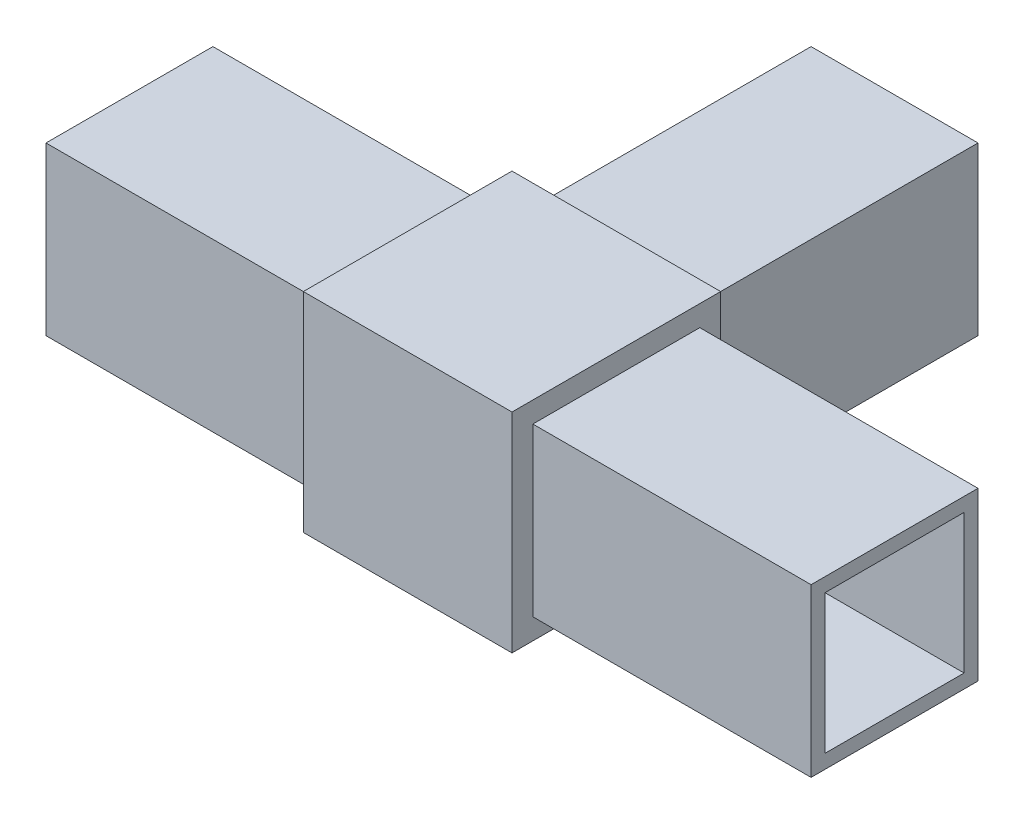
ISO-10303-21;
HEADER;
FILE_DESCRIPTION(('STEP AP214'),'2;1');
FILE_NAME('part.step','',(''),(''),'','','');
FILE_SCHEMA(('AUTOMOTIVE_DESIGN { 1 0 10303 214 1 1 1 1 }'));
ENDSEC;
DATA;
#1=APPLICATION_CONTEXT('core data for automotive mechanical design processes');
#2=APPLICATION_PROTOCOL_DEFINITION('international standard','automotive_design',2000,#1);
#3=PRODUCT_CONTEXT('',#1,'mechanical');
#4=PRODUCT('Part','Part','',(#3));
#5=PRODUCT_RELATED_PRODUCT_CATEGORY('part','',(#4));
#6=PRODUCT_DEFINITION_FORMATION('','',#4);
#7=PRODUCT_DEFINITION_CONTEXT('part definition',#1,'design');
#8=PRODUCT_DEFINITION('design','',#6,#7);
#9=PRODUCT_DEFINITION_SHAPE('','',#8);
#10=(LENGTH_UNIT() NAMED_UNIT(*) SI_UNIT(.MILLI.,.METRE.));
#11=(NAMED_UNIT(*) PLANE_ANGLE_UNIT() SI_UNIT($,.RADIAN.));
#12=(NAMED_UNIT(*) SI_UNIT($,.STERADIAN.) SOLID_ANGLE_UNIT());
#13=UNCERTAINTY_MEASURE_WITH_UNIT(LENGTH_MEASURE(1.E-05),#10,'distance_accuracy_value','');
#14=(GEOMETRIC_REPRESENTATION_CONTEXT(3) GLOBAL_UNCERTAINTY_ASSIGNED_CONTEXT((#13)) GLOBAL_UNIT_ASSIGNED_CONTEXT((#10,
#11,#12)) REPRESENTATION_CONTEXT('',''));
#15=CARTESIAN_POINT('',(0.,0.,0.));
#16=DIRECTION('',(0.,0.,1.));
#17=DIRECTION('',(1.,0.,0.));
#18=AXIS2_PLACEMENT_3D('',#15,#16,#17);
#19=CARTESIAN_POINT('',(55.,30.,-9.06847695767683));
#20=DIRECTION('',(-1.,0.,0.));
#21=DIRECTION('',(0.,0.,1.));
#22=AXIS2_PLACEMENT_3D('',#19,#20,#21);
#23=PLANE('',#22);
#24=DIRECTION('',(0.,-1.,0.));
#25=VECTOR('',#24,1.);
#26=CARTESIAN_POINT('',(55.,27.,12.));
#27=LINE('',#26,#25);
#28=CARTESIAN_POINT('',(55.,27.,12.));
#29=VERTEX_POINT('',#28);
#30=CARTESIAN_POINT('',(55.,3.,12.));
#31=VERTEX_POINT('',#30);
#32=EDGE_CURVE('E459',#29,#31,#27,.T.);
#33=ORIENTED_EDGE('',*,*,#32,.T.);
#34=DIRECTION('',(0.,0.,-1.));
#35=VECTOR('',#34,1.);
#36=CARTESIAN_POINT('',(55.,3.,12.));
#37=LINE('',#36,#35);
#38=CARTESIAN_POINT('',(55.,3.,-12.));
#39=VERTEX_POINT('',#38);
#40=EDGE_CURVE('E476',#31,#39,#37,.T.);
#41=ORIENTED_EDGE('',*,*,#40,.T.);
#42=DIRECTION('',(0.,1.,0.));
#43=VECTOR('',#42,1.);
#44=CARTESIAN_POINT('',(55.,3.,-12.));
#45=LINE('',#44,#43);
#46=CARTESIAN_POINT('',(55.,27.,-12.));
#47=VERTEX_POINT('',#46);
#48=EDGE_CURVE('E479',#39,#47,#45,.T.);
#49=ORIENTED_EDGE('',*,*,#48,.T.);
#50=DIRECTION('',(0.,0.,1.));
#51=VECTOR('',#50,1.);
#52=CARTESIAN_POINT('',(55.,27.,-12.));
#53=LINE('',#52,#51);
#54=EDGE_CURVE('E464',#47,#29,#53,.T.);
#55=ORIENTED_EDGE('',*,*,#54,.T.);
#56=EDGE_LOOP('',(#33,#41,#49,#55));
#57=FACE_BOUND('',#56,.T.);
#58=DIRECTION('',(0.,-1.,0.));
#59=VECTOR('',#58,1.);
#60=CARTESIAN_POINT('',(55.,27.,10.));
#61=LINE('',#60,#59);
#62=CARTESIAN_POINT('',(55.,25.,10.));
#63=VERTEX_POINT('',#62);
#64=CARTESIAN_POINT('',(55.,5.,10.));
#65=VERTEX_POINT('',#64);
#66=EDGE_CURVE('E269',#63,#65,#61,.T.);
#67=ORIENTED_EDGE('',*,*,#66,.F.);
#68=DIRECTION('',(0.,0.,1.));
#69=VECTOR('',#68,1.);
#70=CARTESIAN_POINT('',(55.,25.,-12.));
#71=LINE('',#70,#69);
#72=CARTESIAN_POINT('',(55.,25.,-10.));
#73=VERTEX_POINT('',#72);
#74=EDGE_CURVE('E325',#73,#63,#71,.T.);
#75=ORIENTED_EDGE('',*,*,#74,.F.);
#76=DIRECTION('',(0.,1.,0.));
#77=VECTOR('',#76,1.);
#78=CARTESIAN_POINT('',(55.,3.,-10.));
#79=LINE('',#78,#77);
#80=CARTESIAN_POINT('',(55.,5.,-10.));
#81=VERTEX_POINT('',#80);
#82=EDGE_CURVE('E54',#81,#73,#79,.T.);
#83=ORIENTED_EDGE('',*,*,#82,.F.);
#84=DIRECTION('',(0.,0.,-1.));
#85=VECTOR('',#84,1.);
#86=CARTESIAN_POINT('',(55.,5.,12.));
#87=LINE('',#86,#85);
#88=EDGE_CURVE('E361',#65,#81,#87,.T.);
#89=ORIENTED_EDGE('',*,*,#88,.F.);
#90=EDGE_LOOP('',(#67,#75,#83,#89));
#91=FACE_BOUND('',#90,.T.);
#92=ADVANCED_FACE('F37',(#57,#91),#23,.F.);
#93=CARTESIAN_POINT('',(-109.035099405641,30.,-9.06847695767683));
#94=DIRECTION('',(0.,1.,0.));
#95=DIRECTION('',(0.,0.,1.));
#96=AXIS2_PLACEMENT_3D('',#93,#94,#95);
#97=PLANE('',#96);
#98=DIRECTION('',(-1.,0.,0.));
#99=VECTOR('',#98,1.);
#100=CARTESIAN_POINT('',(-109.035099405641,30.,-15.));
#101=LINE('',#100,#99);
#102=CARTESIAN_POINT('',(15.,30.,-15.));
#103=VERTEX_POINT('',#102);
#104=CARTESIAN_POINT('',(-15.,30.,-15.));
#105=VERTEX_POINT('',#104);
#106=EDGE_CURVE('E496',#103,#105,#101,.T.);
#107=ORIENTED_EDGE('',*,*,#106,.T.);
#108=DIRECTION('',(0.,0.,-1.));
#109=VECTOR('',#108,1.);
#110=CARTESIAN_POINT('',(-15.,30.,15.));
#111=LINE('',#110,#109);
#112=CARTESIAN_POINT('',(-15.,30.,15.));
#113=VERTEX_POINT('',#112);
#114=EDGE_CURVE('E421',#113,#105,#111,.T.);
#115=ORIENTED_EDGE('',*,*,#114,.F.);
#116=DIRECTION('',(-1.,0.,0.));
#117=VECTOR('',#116,1.);
#118=CARTESIAN_POINT('',(-109.035099405641,30.,15.));
#119=LINE('',#118,#117);
#120=CARTESIAN_POINT('',(15.,30.,15.));
#121=VERTEX_POINT('',#120);
#122=EDGE_CURVE('E46',#121,#113,#119,.T.);
#123=ORIENTED_EDGE('',*,*,#122,.F.);
#124=DIRECTION('',(0.,0.,-1.));
#125=VECTOR('',#124,1.);
#126=CARTESIAN_POINT('',(15.,30.,-9.06847695767683));
#127=LINE('',#126,#125);
#128=EDGE_CURVE('E11',#121,#103,#127,.T.);
#129=ORIENTED_EDGE('',*,*,#128,.T.);
#130=EDGE_LOOP('',(#107,#115,#123,#129));
#131=FACE_BOUND('',#130,.T.);
#132=ADVANCED_FACE('F517',(#131),#97,.T.);
#133=CARTESIAN_POINT('',(-109.035099405641,0.,-9.06847695767683));
#134=DIRECTION('',(0.,1.,0.));
#135=DIRECTION('',(0.,0.,1.));
#136=AXIS2_PLACEMENT_3D('',#133,#134,#135);
#137=PLANE('',#136);
#138=DIRECTION('',(0.,0.,1.));
#139=VECTOR('',#138,1.);
#140=CARTESIAN_POINT('',(-15.,0.,-15.));
#141=LINE('',#140,#139);
#142=CARTESIAN_POINT('',(-15.,0.,-15.));
#143=VERTEX_POINT('',#142);
#144=CARTESIAN_POINT('',(-15.,0.,15.));
#145=VERTEX_POINT('',#144);
#146=EDGE_CURVE('E417',#143,#145,#141,.T.);
#147=ORIENTED_EDGE('',*,*,#146,.F.);
#148=DIRECTION('',(-1.,0.,0.));
#149=VECTOR('',#148,1.);
#150=CARTESIAN_POINT('',(-109.035099405641,0.,-15.));
#151=LINE('',#150,#149);
#152=CARTESIAN_POINT('',(15.,0.,-15.));
#153=VERTEX_POINT('',#152);
#154=EDGE_CURVE('E495',#153,#143,#151,.T.);
#155=ORIENTED_EDGE('',*,*,#154,.F.);
#156=DIRECTION('',(0.,0.,-1.));
#157=VECTOR('',#156,1.);
#158=CARTESIAN_POINT('',(15.,0.,-9.06847695767683));
#159=LINE('',#158,#157);
#160=CARTESIAN_POINT('',(15.,0.,15.));
#161=VERTEX_POINT('',#160);
#162=EDGE_CURVE('E41',#161,#153,#159,.T.);
#163=ORIENTED_EDGE('',*,*,#162,.F.);
#164=DIRECTION('',(-1.,0.,0.));
#165=VECTOR('',#164,1.);
#166=CARTESIAN_POINT('',(-109.035099405641,0.,15.));
#167=LINE('',#166,#165);
#168=EDGE_CURVE('E502',#161,#145,#167,.T.);
#169=ORIENTED_EDGE('',*,*,#168,.T.);
#170=EDGE_LOOP('',(#147,#155,#163,#169));
#171=FACE_BOUND('',#170,.T.);
#172=ADVANCED_FACE('F512',(#171),#137,.F.);
#173=CARTESIAN_POINT('',(-109.035099405641,30.,15.));
#174=DIRECTION('',(0.,0.,1.));
#175=DIRECTION('',(1.,0.,0.));
#176=AXIS2_PLACEMENT_3D('',#173,#174,#175);
#177=PLANE('',#176);
#178=ORIENTED_EDGE('',*,*,#122,.T.);
#179=DIRECTION('',(0.,1.,0.));
#180=VECTOR('',#179,1.);
#181=CARTESIAN_POINT('',(-15.,0.,15.));
#182=LINE('',#181,#180);
#183=EDGE_CURVE('E419',#145,#113,#182,.T.);
#184=ORIENTED_EDGE('',*,*,#183,.F.);
#185=ORIENTED_EDGE('',*,*,#168,.F.);
#186=DIRECTION('',(0.,-1.,0.));
#187=VECTOR('',#186,1.);
#188=CARTESIAN_POINT('',(15.,30.,15.));
#189=LINE('',#188,#187);
#190=EDGE_CURVE('E486',#121,#161,#189,.T.);
#191=ORIENTED_EDGE('',*,*,#190,.F.);
#192=EDGE_LOOP('',(#178,#184,#185,#191));
#193=FACE_BOUND('',#192,.T.);
#194=ADVANCED_FACE('F520',(#193),#177,.T.);
#195=CARTESIAN_POINT('',(-109.035099405641,30.,-15.));
#196=DIRECTION('',(0.,0.,1.));
#197=DIRECTION('',(1.,0.,0.));
#198=AXIS2_PLACEMENT_3D('',#195,#196,#197);
#199=PLANE('',#198);
#200=DIRECTION('',(1.,0.,0.));
#201=VECTOR('',#200,1.);
#202=CARTESIAN_POINT('',(-12.,27.,-15.));
#203=LINE('',#202,#201);
#204=CARTESIAN_POINT('',(-12.,27.,-15.));
#205=VERTEX_POINT('',#204);
#206=CARTESIAN_POINT('',(12.,27.,-15.));
#207=VERTEX_POINT('',#206);
#208=EDGE_CURVE('E434',#205,#207,#203,.T.);
#209=ORIENTED_EDGE('',*,*,#208,.F.);
#210=DIRECTION('',(0.,1.,0.));
#211=VECTOR('',#210,1.);
#212=CARTESIAN_POINT('',(-12.,3.,-15.));
#213=LINE('',#212,#211);
#214=CARTESIAN_POINT('',(-12.,3.,-15.));
#215=VERTEX_POINT('',#214);
#216=EDGE_CURVE('E431',#215,#205,#213,.T.);
#217=ORIENTED_EDGE('',*,*,#216,.F.);
#218=DIRECTION('',(-1.,0.,0.));
#219=VECTOR('',#218,1.);
#220=CARTESIAN_POINT('',(12.,3.,-15.));
#221=LINE('',#220,#219);
#222=CARTESIAN_POINT('',(12.,3.,-15.));
#223=VERTEX_POINT('',#222);
#224=EDGE_CURVE('E427',#223,#215,#221,.T.);
#225=ORIENTED_EDGE('',*,*,#224,.F.);
#226=DIRECTION('',(0.,-1.,0.));
#227=VECTOR('',#226,1.);
#228=CARTESIAN_POINT('',(12.,27.,-15.));
#229=LINE('',#228,#227);
#230=EDGE_CURVE('E424',#207,#223,#229,.T.);
#231=ORIENTED_EDGE('',*,*,#230,.F.);
#232=EDGE_LOOP('',(#209,#217,#225,#231));
#233=FACE_BOUND('',#232,.T.);
#234=DIRECTION('',(0.,-1.,0.));
#235=VECTOR('',#234,1.);
#236=CARTESIAN_POINT('',(-15.,30.,-15.));
#237=LINE('',#236,#235);
#238=EDGE_CURVE('E409',#105,#143,#237,.T.);
#239=ORIENTED_EDGE('',*,*,#238,.F.);
#240=ORIENTED_EDGE('',*,*,#106,.F.);
#241=DIRECTION('',(0.,-1.,0.));
#242=VECTOR('',#241,1.);
#243=CARTESIAN_POINT('',(15.,30.,-15.));
#244=LINE('',#243,#242);
#245=EDGE_CURVE('E450',#103,#153,#244,.T.);
#246=ORIENTED_EDGE('',*,*,#245,.T.);
#247=ORIENTED_EDGE('',*,*,#154,.T.);
#248=EDGE_LOOP('',(#239,#240,#246,#247));
#249=FACE_BOUND('',#248,.T.);
#250=ADVANCED_FACE('F39',(#233,#249),#199,.F.);
#251=CARTESIAN_POINT('',(15.,30.,-9.06847695767683));
#252=DIRECTION('',(-1.,0.,0.));
#253=DIRECTION('',(0.,0.,1.));
#254=AXIS2_PLACEMENT_3D('',#251,#252,#253);
#255=PLANE('',#254);
#256=DIRECTION('',(0.,0.,1.));
#257=VECTOR('',#256,1.);
#258=CARTESIAN_POINT('',(15.,27.,-12.));
#259=LINE('',#258,#257);
#260=CARTESIAN_POINT('',(15.,27.,-12.));
#261=VERTEX_POINT('',#260);
#262=CARTESIAN_POINT('',(15.,27.,12.));
#263=VERTEX_POINT('',#262);
#264=EDGE_CURVE('E470',#261,#263,#259,.T.);
#265=ORIENTED_EDGE('',*,*,#264,.F.);
#266=DIRECTION('',(0.,1.,0.));
#267=VECTOR('',#266,1.);
#268=CARTESIAN_POINT('',(15.,3.,-12.));
#269=LINE('',#268,#267);
#270=CARTESIAN_POINT('',(15.,3.,-12.));
#271=VERTEX_POINT('',#270);
#272=EDGE_CURVE('E467',#271,#261,#269,.T.);
#273=ORIENTED_EDGE('',*,*,#272,.F.);
#274=DIRECTION('',(0.,0.,-1.));
#275=VECTOR('',#274,1.);
#276=CARTESIAN_POINT('',(15.,3.,12.));
#277=LINE('',#276,#275);
#278=CARTESIAN_POINT('',(15.,3.,12.));
#279=VERTEX_POINT('',#278);
#280=EDGE_CURVE('E463',#279,#271,#277,.T.);
#281=ORIENTED_EDGE('',*,*,#280,.F.);
#282=DIRECTION('',(0.,-1.,0.));
#283=VECTOR('',#282,1.);
#284=CARTESIAN_POINT('',(15.,27.,12.));
#285=LINE('',#284,#283);
#286=EDGE_CURVE('E460',#263,#279,#285,.T.);
#287=ORIENTED_EDGE('',*,*,#286,.F.);
#288=EDGE_LOOP('',(#265,#273,#281,#287));
#289=FACE_BOUND('',#288,.T.);
#290=ORIENTED_EDGE('',*,*,#245,.F.);
#291=ORIENTED_EDGE('',*,*,#128,.F.);
#292=ORIENTED_EDGE('',*,*,#190,.T.);
#293=ORIENTED_EDGE('',*,*,#162,.T.);
#294=EDGE_LOOP('',(#290,#291,#292,#293));
#295=FACE_BOUND('',#294,.T.);
#296=ADVANCED_FACE('F510',(#289,#295),#255,.F.);
#297=CARTESIAN_POINT('',(15.,27.,12.));
#298=DIRECTION('',(0.,0.,1.));
#299=DIRECTION('',(1.,0.,0.));
#300=AXIS2_PLACEMENT_3D('',#297,#298,#299);
#301=PLANE('',#300);
#302=ORIENTED_EDGE('',*,*,#32,.F.);
#303=DIRECTION('',(1.,0.,0.));
#304=VECTOR('',#303,1.);
#305=CARTESIAN_POINT('',(15.,27.,12.));
#306=LINE('',#305,#304);
#307=EDGE_CURVE('E484',#263,#29,#306,.T.);
#308=ORIENTED_EDGE('',*,*,#307,.F.);
#309=ORIENTED_EDGE('',*,*,#286,.T.);
#310=DIRECTION('',(1.,0.,0.));
#311=VECTOR('',#310,1.);
#312=CARTESIAN_POINT('',(15.,3.,12.));
#313=LINE('',#312,#311);
#314=EDGE_CURVE('E473',#279,#31,#313,.T.);
#315=ORIENTED_EDGE('',*,*,#314,.T.);
#316=EDGE_LOOP('',(#302,#308,#309,#315));
#317=FACE_BOUND('',#316,.T.);
#318=ADVANCED_FACE('F906',(#317),#301,.T.);
#319=CARTESIAN_POINT('',(15.,27.,-12.));
#320=DIRECTION('',(0.,1.,0.));
#321=DIRECTION('',(0.,0.,1.));
#322=AXIS2_PLACEMENT_3D('',#319,#320,#321);
#323=PLANE('',#322);
#324=ORIENTED_EDGE('',*,*,#54,.F.);
#325=DIRECTION('',(1.,0.,0.));
#326=VECTOR('',#325,1.);
#327=CARTESIAN_POINT('',(15.,27.,-12.));
#328=LINE('',#327,#326);
#329=EDGE_CURVE('E487',#261,#47,#328,.T.);
#330=ORIENTED_EDGE('',*,*,#329,.F.);
#331=ORIENTED_EDGE('',*,*,#264,.T.);
#332=ORIENTED_EDGE('',*,*,#307,.T.);
#333=EDGE_LOOP('',(#324,#330,#331,#332));
#334=FACE_BOUND('',#333,.T.);
#335=ADVANCED_FACE('F924',(#334),#323,.T.);
#336=CARTESIAN_POINT('',(15.,3.,-12.));
#337=DIRECTION('',(0.,0.,-1.));
#338=DIRECTION('',(-1.,0.,0.));
#339=AXIS2_PLACEMENT_3D('',#336,#337,#338);
#340=PLANE('',#339);
#341=ORIENTED_EDGE('',*,*,#48,.F.);
#342=DIRECTION('',(1.,0.,0.));
#343=VECTOR('',#342,1.);
#344=CARTESIAN_POINT('',(15.,3.,-12.));
#345=LINE('',#344,#343);
#346=EDGE_CURVE('E489',#271,#39,#345,.T.);
#347=ORIENTED_EDGE('',*,*,#346,.F.);
#348=ORIENTED_EDGE('',*,*,#272,.T.);
#349=ORIENTED_EDGE('',*,*,#329,.T.);
#350=EDGE_LOOP('',(#341,#347,#348,#349));
#351=FACE_BOUND('',#350,.T.);
#352=ADVANCED_FACE('F914',(#351),#340,.T.);
#353=CARTESIAN_POINT('',(15.,3.,12.));
#354=DIRECTION('',(0.,-1.,0.));
#355=DIRECTION('',(0.,0.,-1.));
#356=AXIS2_PLACEMENT_3D('',#353,#354,#355);
#357=PLANE('',#356);
#358=ORIENTED_EDGE('',*,*,#40,.F.);
#359=ORIENTED_EDGE('',*,*,#314,.F.);
#360=ORIENTED_EDGE('',*,*,#280,.T.);
#361=ORIENTED_EDGE('',*,*,#346,.T.);
#362=EDGE_LOOP('',(#358,#359,#360,#361));
#363=FACE_BOUND('',#362,.T.);
#364=ADVANCED_FACE('F896',(#363),#357,.T.);
#365=CARTESIAN_POINT('',(12.,27.,-15.));
#366=DIRECTION('',(1.,0.,0.));
#367=DIRECTION('',(0.,1.,0.));
#368=AXIS2_PLACEMENT_3D('',#365,#366,#367);
#369=PLANE('',#368);
#370=DIRECTION('',(0.,-1.,0.));
#371=VECTOR('',#370,1.);
#372=CARTESIAN_POINT('',(12.,27.,-55.));
#373=LINE('',#372,#371);
#374=CARTESIAN_POINT('',(12.,27.,-55.));
#375=VERTEX_POINT('',#374);
#376=CARTESIAN_POINT('',(12.,3.,-55.));
#377=VERTEX_POINT('',#376);
#378=EDGE_CURVE('E423',#375,#377,#373,.T.);
#379=ORIENTED_EDGE('',*,*,#378,.F.);
#380=DIRECTION('',(0.,0.,-1.));
#381=VECTOR('',#380,1.);
#382=CARTESIAN_POINT('',(12.,27.,-15.));
#383=LINE('',#382,#381);
#384=EDGE_CURVE('E448',#207,#375,#383,.T.);
#385=ORIENTED_EDGE('',*,*,#384,.F.);
#386=ORIENTED_EDGE('',*,*,#230,.T.);
#387=DIRECTION('',(0.,0.,-1.));
#388=VECTOR('',#387,1.);
#389=CARTESIAN_POINT('',(12.,3.,-15.));
#390=LINE('',#389,#388);
#391=EDGE_CURVE('E437',#223,#377,#390,.T.);
#392=ORIENTED_EDGE('',*,*,#391,.T.);
#393=EDGE_LOOP('',(#379,#385,#386,#392));
#394=FACE_BOUND('',#393,.T.);
#395=ADVANCED_FACE('F887',(#394),#369,.T.);
#396=CARTESIAN_POINT('',(-12.,27.,-15.));
#397=DIRECTION('',(0.,1.,0.));
#398=DIRECTION('',(-1.,0.,0.));
#399=AXIS2_PLACEMENT_3D('',#396,#397,#398);
#400=PLANE('',#399);
#401=DIRECTION('',(1.,0.,0.));
#402=VECTOR('',#401,1.);
#403=CARTESIAN_POINT('',(-12.,27.,-55.));
#404=LINE('',#403,#402);
#405=CARTESIAN_POINT('',(-12.,27.,-55.));
#406=VERTEX_POINT('',#405);
#407=EDGE_CURVE('E428',#406,#375,#404,.T.);
#408=ORIENTED_EDGE('',*,*,#407,.F.);
#409=DIRECTION('',(0.,0.,-1.));
#410=VECTOR('',#409,1.);
#411=CARTESIAN_POINT('',(-12.,27.,-15.));
#412=LINE('',#411,#410);
#413=EDGE_CURVE('E451',#205,#406,#412,.T.);
#414=ORIENTED_EDGE('',*,*,#413,.F.);
#415=ORIENTED_EDGE('',*,*,#208,.T.);
#416=ORIENTED_EDGE('',*,*,#384,.T.);
#417=EDGE_LOOP('',(#408,#414,#415,#416));
#418=FACE_BOUND('',#417,.T.);
#419=ADVANCED_FACE('F877',(#418),#400,.T.);
#420=CARTESIAN_POINT('',(-12.,3.,-15.));
#421=DIRECTION('',(-1.,0.,0.));
#422=DIRECTION('',(0.,0.,1.));
#423=AXIS2_PLACEMENT_3D('',#420,#421,#422);
#424=PLANE('',#423);
#425=DIRECTION('',(0.,1.,0.));
#426=VECTOR('',#425,1.);
#427=CARTESIAN_POINT('',(-12.,3.,-55.));
#428=LINE('',#427,#426);
#429=CARTESIAN_POINT('',(-12.,3.,-55.));
#430=VERTEX_POINT('',#429);
#431=EDGE_CURVE('E443',#430,#406,#428,.T.);
#432=ORIENTED_EDGE('',*,*,#431,.F.);
#433=DIRECTION('',(0.,0.,-1.));
#434=VECTOR('',#433,1.);
#435=CARTESIAN_POINT('',(-12.,3.,-15.));
#436=LINE('',#435,#434);
#437=EDGE_CURVE('E453',#215,#430,#436,.T.);
#438=ORIENTED_EDGE('',*,*,#437,.F.);
#439=ORIENTED_EDGE('',*,*,#216,.T.);
#440=ORIENTED_EDGE('',*,*,#413,.T.);
#441=EDGE_LOOP('',(#432,#438,#439,#440));
#442=FACE_BOUND('',#441,.T.);
#443=ADVANCED_FACE('F867',(#442),#424,.T.);
#444=CARTESIAN_POINT('',(12.,3.,-15.));
#445=DIRECTION('',(0.,-1.,0.));
#446=DIRECTION('',(1.,0.,0.));
#447=AXIS2_PLACEMENT_3D('',#444,#445,#446);
#448=PLANE('',#447);
#449=DIRECTION('',(-1.,0.,0.));
#450=VECTOR('',#449,1.);
#451=CARTESIAN_POINT('',(12.,3.,-55.));
#452=LINE('',#451,#450);
#453=EDGE_CURVE('E440',#377,#430,#452,.T.);
#454=ORIENTED_EDGE('',*,*,#453,.F.);
#455=ORIENTED_EDGE('',*,*,#391,.F.);
#456=ORIENTED_EDGE('',*,*,#224,.T.);
#457=ORIENTED_EDGE('',*,*,#437,.T.);
#458=EDGE_LOOP('',(#454,#455,#456,#457));
#459=FACE_BOUND('',#458,.T.);
#460=ADVANCED_FACE('F536',(#459),#448,.T.);
#461=CARTESIAN_POINT('',(-109.035099405641,30.,-55.));
#462=DIRECTION('',(0.,0.,-1.));
#463=DIRECTION('',(-1.,0.,0.));
#464=AXIS2_PLACEMENT_3D('',#461,#462,#463);
#465=PLANE('',#464);
#466=DIRECTION('',(1.,0.,0.));
#467=VECTOR('',#466,1.);
#468=CARTESIAN_POINT('',(-109.035099405641,25.,-55.));
#469=LINE('',#468,#467);
#470=CARTESIAN_POINT('',(-10.,25.,-55.));
#471=VERTEX_POINT('',#470);
#472=CARTESIAN_POINT('',(10.,25.,-55.));
#473=VERTEX_POINT('',#472);
#474=EDGE_CURVE('E309',#471,#473,#469,.T.);
#475=ORIENTED_EDGE('',*,*,#474,.F.);
#476=DIRECTION('',(0.,1.,0.));
#477=VECTOR('',#476,1.);
#478=CARTESIAN_POINT('',(-9.99999999999999,30.,-55.));
#479=LINE('',#478,#477);
#480=CARTESIAN_POINT('',(-10.,5.,-55.));
#481=VERTEX_POINT('',#480);
#482=EDGE_CURVE('E371',#481,#471,#479,.T.);
#483=ORIENTED_EDGE('',*,*,#482,.F.);
#484=DIRECTION('',(-1.,0.,0.));
#485=VECTOR('',#484,1.);
#486=CARTESIAN_POINT('',(-109.035099405641,5.00000000000001,-55.));
#487=LINE('',#486,#485);
#488=CARTESIAN_POINT('',(10.,5.,-55.));
#489=VERTEX_POINT('',#488);
#490=EDGE_CURVE('E62',#489,#481,#487,.T.);
#491=ORIENTED_EDGE('',*,*,#490,.F.);
#492=DIRECTION('',(0.,-1.,0.));
#493=VECTOR('',#492,1.);
#494=CARTESIAN_POINT('',(10.,30.,-55.));
#495=LINE('',#494,#493);
#496=EDGE_CURVE('E367',#473,#489,#495,.T.);
#497=ORIENTED_EDGE('',*,*,#496,.F.);
#498=EDGE_LOOP('',(#475,#483,#491,#497));
#499=FACE_BOUND('',#498,.T.);
#500=ORIENTED_EDGE('',*,*,#407,.T.);
#501=ORIENTED_EDGE('',*,*,#378,.T.);
#502=ORIENTED_EDGE('',*,*,#453,.T.);
#503=ORIENTED_EDGE('',*,*,#431,.T.);
#504=EDGE_LOOP('',(#500,#501,#502,#503));
#505=FACE_BOUND('',#504,.T.);
#506=ADVANCED_FACE('F526',(#499,#505),#465,.T.);
#507=CARTESIAN_POINT('',(-15.,0.,-15.));
#508=DIRECTION('',(-1.,0.,0.));
#509=DIRECTION('',(0.,0.,1.));
#510=AXIS2_PLACEMENT_3D('',#507,#508,#509);
#511=PLANE('',#510);
#512=DIRECTION('',(0.,0.,-1.));
#513=VECTOR('',#512,1.);
#514=CARTESIAN_POINT('',(-15.,27.,12.));
#515=LINE('',#514,#513);
#516=CARTESIAN_POINT('',(-15.,27.,12.));
#517=VERTEX_POINT('',#516);
#518=CARTESIAN_POINT('',(-15.,27.,-12.));
#519=VERTEX_POINT('',#518);
#520=EDGE_CURVE('E396',#517,#519,#515,.T.);
#521=ORIENTED_EDGE('',*,*,#520,.F.);
#522=DIRECTION('',(0.,1.,0.));
#523=VECTOR('',#522,1.);
#524=CARTESIAN_POINT('',(-15.,3.,12.));
#525=LINE('',#524,#523);
#526=CARTESIAN_POINT('',(-15.,3.,12.));
#527=VERTEX_POINT('',#526);
#528=EDGE_CURVE('E393',#527,#517,#525,.T.);
#529=ORIENTED_EDGE('',*,*,#528,.F.);
#530=DIRECTION('',(0.,0.,1.));
#531=VECTOR('',#530,1.);
#532=CARTESIAN_POINT('',(-15.,3.,-12.));
#533=LINE('',#532,#531);
#534=CARTESIAN_POINT('',(-15.,3.,-12.));
#535=VERTEX_POINT('',#534);
#536=EDGE_CURVE('E389',#535,#527,#533,.T.);
#537=ORIENTED_EDGE('',*,*,#536,.F.);
#538=DIRECTION('',(0.,-1.,0.));
#539=VECTOR('',#538,1.);
#540=CARTESIAN_POINT('',(-15.,27.,-12.));
#541=LINE('',#540,#539);
#542=EDGE_CURVE('E386',#519,#535,#541,.T.);
#543=ORIENTED_EDGE('',*,*,#542,.F.);
#544=EDGE_LOOP('',(#521,#529,#537,#543));
#545=FACE_BOUND('',#544,.T.);
#546=ORIENTED_EDGE('',*,*,#238,.T.);
#547=ORIENTED_EDGE('',*,*,#146,.T.);
#548=ORIENTED_EDGE('',*,*,#183,.T.);
#549=ORIENTED_EDGE('',*,*,#114,.T.);
#550=EDGE_LOOP('',(#546,#547,#548,#549));
#551=FACE_BOUND('',#550,.T.);
#552=ADVANCED_FACE('F523',(#545,#551),#511,.T.);
#553=CARTESIAN_POINT('',(-15.,27.,-12.));
#554=DIRECTION('',(0.,0.,-1.));
#555=DIRECTION('',(0.,1.,0.));
#556=AXIS2_PLACEMENT_3D('',#553,#554,#555);
#557=PLANE('',#556);
#558=DIRECTION('',(0.,-1.,0.));
#559=VECTOR('',#558,1.);
#560=CARTESIAN_POINT('',(-55.,27.,-12.));
#561=LINE('',#560,#559);
#562=CARTESIAN_POINT('',(-55.,27.,-12.));
#563=VERTEX_POINT('',#562);
#564=CARTESIAN_POINT('',(-55.,3.,-12.));
#565=VERTEX_POINT('',#564);
#566=EDGE_CURVE('E276',#563,#565,#561,.T.);
#567=ORIENTED_EDGE('',*,*,#566,.F.);
#568=DIRECTION('',(-1.,0.,0.));
#569=VECTOR('',#568,1.);
#570=CARTESIAN_POINT('',(-15.,27.,-12.));
#571=LINE('',#570,#569);
#572=EDGE_CURVE('E407',#519,#563,#571,.T.);
#573=ORIENTED_EDGE('',*,*,#572,.F.);
#574=ORIENTED_EDGE('',*,*,#542,.T.);
#575=DIRECTION('',(-1.,0.,0.));
#576=VECTOR('',#575,1.);
#577=CARTESIAN_POINT('',(-15.,3.,-12.));
#578=LINE('',#577,#576);
#579=EDGE_CURVE('E398',#535,#565,#578,.T.);
#580=ORIENTED_EDGE('',*,*,#579,.T.);
#581=EDGE_LOOP('',(#567,#573,#574,#580));
#582=FACE_BOUND('',#581,.T.);
#583=ADVANCED_FACE('F525',(#582),#557,.T.);
#584=CARTESIAN_POINT('',(-15.,27.,12.));
#585=DIRECTION('',(0.,1.,0.));
#586=DIRECTION('',(0.,0.,1.));
#587=AXIS2_PLACEMENT_3D('',#584,#585,#586);
#588=PLANE('',#587);
#589=DIRECTION('',(0.,0.,-1.));
#590=VECTOR('',#589,1.);
#591=CARTESIAN_POINT('',(-55.,27.,12.));
#592=LINE('',#591,#590);
#593=CARTESIAN_POINT('',(-55.,27.,12.));
#594=VERTEX_POINT('',#593);
#595=EDGE_CURVE('E390',#594,#563,#592,.T.);
#596=ORIENTED_EDGE('',*,*,#595,.F.);
#597=DIRECTION('',(-1.,0.,0.));
#598=VECTOR('',#597,1.);
#599=CARTESIAN_POINT('',(-15.,27.,12.));
#600=LINE('',#599,#598);
#601=EDGE_CURVE('E410',#517,#594,#600,.T.);
#602=ORIENTED_EDGE('',*,*,#601,.F.);
#603=ORIENTED_EDGE('',*,*,#520,.T.);
#604=ORIENTED_EDGE('',*,*,#572,.T.);
#605=EDGE_LOOP('',(#596,#602,#603,#604));
#606=FACE_BOUND('',#605,.T.);
#607=ADVANCED_FACE('F533',(#606),#588,.T.);
#608=CARTESIAN_POINT('',(-15.,3.,12.));
#609=DIRECTION('',(0.,0.,1.));
#610=DIRECTION('',(1.,0.,0.));
#611=AXIS2_PLACEMENT_3D('',#608,#609,#610);
#612=PLANE('',#611);
#613=DIRECTION('',(0.,1.,0.));
#614=VECTOR('',#613,1.);
#615=CARTESIAN_POINT('',(-55.,3.,12.));
#616=LINE('',#615,#614);
#617=CARTESIAN_POINT('',(-55.,3.,12.));
#618=VERTEX_POINT('',#617);
#619=EDGE_CURVE('E402',#618,#594,#616,.T.);
#620=ORIENTED_EDGE('',*,*,#619,.F.);
#621=DIRECTION('',(-1.,0.,0.));
#622=VECTOR('',#621,1.);
#623=CARTESIAN_POINT('',(-15.,3.,12.));
#624=LINE('',#623,#622);
#625=EDGE_CURVE('E412',#527,#618,#624,.T.);
#626=ORIENTED_EDGE('',*,*,#625,.F.);
#627=ORIENTED_EDGE('',*,*,#528,.T.);
#628=ORIENTED_EDGE('',*,*,#601,.T.);
#629=EDGE_LOOP('',(#620,#626,#627,#628));
#630=FACE_BOUND('',#629,.T.);
#631=ADVANCED_FACE('F562',(#630),#612,.T.);
#632=CARTESIAN_POINT('',(-15.,3.,-12.));
#633=DIRECTION('',(0.,-1.,0.));
#634=DIRECTION('',(0.,0.,-1.));
#635=AXIS2_PLACEMENT_3D('',#632,#633,#634);
#636=PLANE('',#635);
#637=DIRECTION('',(0.,0.,1.));
#638=VECTOR('',#637,1.);
#639=CARTESIAN_POINT('',(-55.,3.,-12.));
#640=LINE('',#639,#638);
#641=EDGE_CURVE('E279',#565,#618,#640,.T.);
#642=ORIENTED_EDGE('',*,*,#641,.F.);
#643=ORIENTED_EDGE('',*,*,#579,.F.);
#644=ORIENTED_EDGE('',*,*,#536,.T.);
#645=ORIENTED_EDGE('',*,*,#625,.T.);
#646=EDGE_LOOP('',(#642,#643,#644,#645));
#647=FACE_BOUND('',#646,.T.);
#648=ADVANCED_FACE('F554',(#647),#636,.T.);
#649=CARTESIAN_POINT('',(-55.,30.,-9.06847695767681));
#650=DIRECTION('',(-1.,0.,0.));
#651=DIRECTION('',(0.,0.,1.));
#652=AXIS2_PLACEMENT_3D('',#649,#650,#651);
#653=PLANE('',#652);
#654=DIRECTION('',(0.,0.,-1.));
#655=VECTOR('',#654,1.);
#656=CARTESIAN_POINT('',(-55.,25.,-9.06847695767681));
#657=LINE('',#656,#655);
#658=CARTESIAN_POINT('',(-55.,25.,10.));
#659=VERTEX_POINT('',#658);
#660=CARTESIAN_POINT('',(-55.,25.,-9.99999999999999));
#661=VERTEX_POINT('',#660);
#662=EDGE_CURVE('E351',#659,#661,#657,.T.);
#663=ORIENTED_EDGE('',*,*,#662,.F.);
#664=DIRECTION('',(0.,1.,0.));
#665=VECTOR('',#664,1.);
#666=CARTESIAN_POINT('',(-55.,30.,10.));
#667=LINE('',#666,#665);
#668=CARTESIAN_POINT('',(-55.,5.,10.));
#669=VERTEX_POINT('',#668);
#670=EDGE_CURVE('E381',#669,#659,#667,.T.);
#671=ORIENTED_EDGE('',*,*,#670,.F.);
#672=DIRECTION('',(0.,0.,1.));
#673=VECTOR('',#672,1.);
#674=CARTESIAN_POINT('',(-55.,5.,-9.06847695767681));
#675=LINE('',#674,#673);
#676=CARTESIAN_POINT('',(-55.,5.,-9.99999999999998));
#677=VERTEX_POINT('',#676);
#678=EDGE_CURVE('E379',#677,#669,#675,.T.);
#679=ORIENTED_EDGE('',*,*,#678,.F.);
#680=DIRECTION('',(0.,-1.,0.));
#681=VECTOR('',#680,1.);
#682=CARTESIAN_POINT('',(-55.,30.,-9.99999999999999));
#683=LINE('',#682,#681);
#684=EDGE_CURVE('E376',#661,#677,#683,.T.);
#685=ORIENTED_EDGE('',*,*,#684,.F.);
#686=EDGE_LOOP('',(#663,#671,#679,#685));
#687=FACE_BOUND('',#686,.T.);
#688=ORIENTED_EDGE('',*,*,#595,.T.);
#689=ORIENTED_EDGE('',*,*,#566,.T.);
#690=ORIENTED_EDGE('',*,*,#641,.T.);
#691=ORIENTED_EDGE('',*,*,#619,.T.);
#692=EDGE_LOOP('',(#688,#689,#690,#691));
#693=FACE_BOUND('',#692,.T.);
#694=ADVANCED_FACE('F552',(#687,#693),#653,.T.);
#695=CARTESIAN_POINT('',(-109.035099405641,28.,-9.06847695767683));
#696=DIRECTION('',(0.,1.,0.));
#697=DIRECTION('',(0.,0.,1.));
#698=AXIS2_PLACEMENT_3D('',#695,#696,#697);
#699=PLANE('',#698);
#700=DIRECTION('',(-1.,0.,0.));
#701=VECTOR('',#700,1.);
#702=CARTESIAN_POINT('',(-109.035099405641,28.,-13.));
#703=LINE('',#702,#701);
#704=CARTESIAN_POINT('',(13.,28.,-13.));
#705=VERTEX_POINT('',#704);
#706=CARTESIAN_POINT('',(-13.,28.,-13.));
#707=VERTEX_POINT('',#706);
#708=EDGE_CURVE('E248',#705,#707,#703,.T.);
#709=ORIENTED_EDGE('',*,*,#708,.F.);
#710=DIRECTION('',(0.,0.,-1.));
#711=VECTOR('',#710,1.);
#712=CARTESIAN_POINT('',(13.,28.,-9.06847695767683));
#713=LINE('',#712,#711);
#714=CARTESIAN_POINT('',(13.,28.,13.));
#715=VERTEX_POINT('',#714);
#716=EDGE_CURVE('E253',#715,#705,#713,.T.);
#717=ORIENTED_EDGE('',*,*,#716,.F.);
#718=DIRECTION('',(-1.,0.,0.));
#719=VECTOR('',#718,1.);
#720=CARTESIAN_POINT('',(-109.035099405641,28.,13.));
#721=LINE('',#720,#719);
#722=CARTESIAN_POINT('',(-13.,28.,13.));
#723=VERTEX_POINT('',#722);
#724=EDGE_CURVE('E259',#715,#723,#721,.T.);
#725=ORIENTED_EDGE('',*,*,#724,.T.);
#726=DIRECTION('',(0.,0.,-1.));
#727=VECTOR('',#726,1.);
#728=CARTESIAN_POINT('',(-13.,28.,-15.));
#729=LINE('',#728,#727);
#730=EDGE_CURVE('E256',#723,#707,#729,.T.);
#731=ORIENTED_EDGE('',*,*,#730,.T.);
#732=EDGE_LOOP('',(#709,#717,#725,#731));
#733=FACE_BOUND('',#732,.T.);
#734=ADVANCED_FACE('F250',(#733),#699,.F.);
#735=CARTESIAN_POINT('',(-109.035099405641,2.,-9.06847695767683));
#736=DIRECTION('',(0.,1.,0.));
#737=DIRECTION('',(0.,0.,1.));
#738=AXIS2_PLACEMENT_3D('',#735,#736,#737);
#739=PLANE('',#738);
#740=DIRECTION('',(0.,0.,1.));
#741=VECTOR('',#740,1.);
#742=CARTESIAN_POINT('',(-13.,2.,-9.06847695767683));
#743=LINE('',#742,#741);
#744=CARTESIAN_POINT('',(-13.,2.,-13.));
#745=VERTEX_POINT('',#744);
#746=CARTESIAN_POINT('',(-13.,2.,13.));
#747=VERTEX_POINT('',#746);
#748=EDGE_CURVE('E286',#745,#747,#743,.T.);
#749=ORIENTED_EDGE('',*,*,#748,.T.);
#750=DIRECTION('',(-1.,0.,0.));
#751=VECTOR('',#750,1.);
#752=CARTESIAN_POINT('',(-109.035099405641,2.,13.));
#753=LINE('',#752,#751);
#754=CARTESIAN_POINT('',(13.,2.,13.));
#755=VERTEX_POINT('',#754);
#756=EDGE_CURVE('E287',#755,#747,#753,.T.);
#757=ORIENTED_EDGE('',*,*,#756,.F.);
#758=DIRECTION('',(0.,0.,-1.));
#759=VECTOR('',#758,1.);
#760=CARTESIAN_POINT('',(13.,2.,-9.06847695767683));
#761=LINE('',#760,#759);
#762=CARTESIAN_POINT('',(13.,2.,-13.));
#763=VERTEX_POINT('',#762);
#764=EDGE_CURVE('E260',#755,#763,#761,.T.);
#765=ORIENTED_EDGE('',*,*,#764,.T.);
#766=DIRECTION('',(-1.,0.,0.));
#767=VECTOR('',#766,1.);
#768=CARTESIAN_POINT('',(-109.035099405641,2.,-13.));
#769=LINE('',#768,#767);
#770=EDGE_CURVE('E266',#763,#745,#769,.T.);
#771=ORIENTED_EDGE('',*,*,#770,.T.);
#772=EDGE_LOOP('',(#749,#757,#765,#771));
#773=FACE_BOUND('',#772,.T.);
#774=ADVANCED_FACE('F560',(#773),#739,.T.);
#775=CARTESIAN_POINT('',(-109.035099405641,30.,13.));
#776=DIRECTION('',(0.,0.,1.));
#777=DIRECTION('',(1.,0.,0.));
#778=AXIS2_PLACEMENT_3D('',#775,#776,#777);
#779=PLANE('',#778);
#780=ORIENTED_EDGE('',*,*,#724,.F.);
#781=DIRECTION('',(0.,-1.,0.));
#782=VECTOR('',#781,1.);
#783=CARTESIAN_POINT('',(13.,30.,13.));
#784=LINE('',#783,#782);
#785=EDGE_CURVE('E274',#715,#755,#784,.T.);
#786=ORIENTED_EDGE('',*,*,#785,.T.);
#787=ORIENTED_EDGE('',*,*,#756,.T.);
#788=DIRECTION('',(0.,1.,0.));
#789=VECTOR('',#788,1.);
#790=CARTESIAN_POINT('',(-13.,0.,13.));
#791=LINE('',#790,#789);
#792=EDGE_CURVE('E284',#747,#723,#791,.T.);
#793=ORIENTED_EDGE('',*,*,#792,.T.);
#794=EDGE_LOOP('',(#780,#786,#787,#793));
#795=FACE_BOUND('',#794,.T.);
#796=ADVANCED_FACE('F639',(#795),#779,.F.);
#797=CARTESIAN_POINT('',(-109.035099405641,30.,-13.));
#798=DIRECTION('',(0.,0.,1.));
#799=DIRECTION('',(1.,0.,0.));
#800=AXIS2_PLACEMENT_3D('',#797,#798,#799);
#801=PLANE('',#800);
#802=DIRECTION('',(1.,0.,0.));
#803=VECTOR('',#802,1.);
#804=CARTESIAN_POINT('',(-12.,25.,-13.));
#805=LINE('',#804,#803);
#806=CARTESIAN_POINT('',(-10.,25.,-13.));
#807=VERTEX_POINT('',#806);
#808=CARTESIAN_POINT('',(10.,25.,-13.));
#809=VERTEX_POINT('',#808);
#810=EDGE_CURVE('E296',#807,#809,#805,.T.);
#811=ORIENTED_EDGE('',*,*,#810,.T.);
#812=DIRECTION('',(0.,-1.,0.));
#813=VECTOR('',#812,1.);
#814=CARTESIAN_POINT('',(10.,27.,-13.));
#815=LINE('',#814,#813);
#816=CARTESIAN_POINT('',(10.,5.,-13.));
#817=VERTEX_POINT('',#816);
#818=EDGE_CURVE('E306',#809,#817,#815,.T.);
#819=ORIENTED_EDGE('',*,*,#818,.T.);
#820=DIRECTION('',(-1.,0.,0.));
#821=VECTOR('',#820,1.);
#822=CARTESIAN_POINT('',(12.,5.,-13.));
#823=LINE('',#822,#821);
#824=CARTESIAN_POINT('',(-10.,5.,-13.));
#825=VERTEX_POINT('',#824);
#826=EDGE_CURVE('E303',#817,#825,#823,.T.);
#827=ORIENTED_EDGE('',*,*,#826,.T.);
#828=DIRECTION('',(0.,1.,0.));
#829=VECTOR('',#828,1.);
#830=CARTESIAN_POINT('',(-10.,3.,-13.));
#831=LINE('',#830,#829);
#832=EDGE_CURVE('E300',#825,#807,#831,.T.);
#833=ORIENTED_EDGE('',*,*,#832,.T.);
#834=EDGE_LOOP('',(#811,#819,#827,#833));
#835=FACE_BOUND('',#834,.T.);
#836=DIRECTION('',(0.,-1.,0.));
#837=VECTOR('',#836,1.);
#838=CARTESIAN_POINT('',(-13.,30.,-13.));
#839=LINE('',#838,#837);
#840=EDGE_CURVE('E293',#707,#745,#839,.T.);
#841=ORIENTED_EDGE('',*,*,#840,.T.);
#842=ORIENTED_EDGE('',*,*,#770,.F.);
#843=DIRECTION('',(0.,-1.,0.));
#844=VECTOR('',#843,1.);
#845=CARTESIAN_POINT('',(13.,30.,-13.));
#846=LINE('',#845,#844);
#847=EDGE_CURVE('E263',#705,#763,#846,.T.);
#848=ORIENTED_EDGE('',*,*,#847,.F.);
#849=ORIENTED_EDGE('',*,*,#708,.T.);
#850=EDGE_LOOP('',(#841,#842,#848,#849));
#851=FACE_BOUND('',#850,.T.);
#852=ADVANCED_FACE('F264',(#835,#851),#801,.T.);
#853=CARTESIAN_POINT('',(13.,30.,-9.06847695767683));
#854=DIRECTION('',(-1.,0.,0.));
#855=DIRECTION('',(0.,0.,1.));
#856=AXIS2_PLACEMENT_3D('',#853,#854,#855);
#857=PLANE('',#856);
#858=DIRECTION('',(0.,0.,1.));
#859=VECTOR('',#858,1.);
#860=CARTESIAN_POINT('',(13.,25.,-12.));
#861=LINE('',#860,#859);
#862=CARTESIAN_POINT('',(13.,25.,-10.));
#863=VERTEX_POINT('',#862);
#864=CARTESIAN_POINT('',(13.,25.,10.));
#865=VERTEX_POINT('',#864);
#866=EDGE_CURVE('E312',#863,#865,#861,.T.);
#867=ORIENTED_EDGE('',*,*,#866,.T.);
#868=DIRECTION('',(0.,-1.,0.));
#869=VECTOR('',#868,1.);
#870=CARTESIAN_POINT('',(13.,27.,10.));
#871=LINE('',#870,#869);
#872=CARTESIAN_POINT('',(13.,5.,10.));
#873=VERTEX_POINT('',#872);
#874=EDGE_CURVE('E322',#865,#873,#871,.T.);
#875=ORIENTED_EDGE('',*,*,#874,.T.);
#876=DIRECTION('',(0.,0.,-1.));
#877=VECTOR('',#876,1.);
#878=CARTESIAN_POINT('',(13.,5.,12.));
#879=LINE('',#878,#877);
#880=CARTESIAN_POINT('',(13.,5.,-10.));
#881=VERTEX_POINT('',#880);
#882=EDGE_CURVE('E319',#873,#881,#879,.T.);
#883=ORIENTED_EDGE('',*,*,#882,.T.);
#884=DIRECTION('',(0.,1.,0.));
#885=VECTOR('',#884,1.);
#886=CARTESIAN_POINT('',(13.,3.,-10.));
#887=LINE('',#886,#885);
#888=EDGE_CURVE('E316',#881,#863,#887,.T.);
#889=ORIENTED_EDGE('',*,*,#888,.T.);
#890=EDGE_LOOP('',(#867,#875,#883,#889));
#891=FACE_BOUND('',#890,.T.);
#892=ORIENTED_EDGE('',*,*,#847,.T.);
#893=ORIENTED_EDGE('',*,*,#764,.F.);
#894=ORIENTED_EDGE('',*,*,#785,.F.);
#895=ORIENTED_EDGE('',*,*,#716,.T.);
#896=EDGE_LOOP('',(#892,#893,#894,#895));
#897=FACE_BOUND('',#896,.T.);
#898=ADVANCED_FACE('F272',(#891,#897),#857,.T.);
#899=CARTESIAN_POINT('',(15.,27.,10.));
#900=DIRECTION('',(0.,0.,1.));
#901=DIRECTION('',(1.,0.,0.));
#902=AXIS2_PLACEMENT_3D('',#899,#900,#901);
#903=PLANE('',#902);
#904=ORIENTED_EDGE('',*,*,#66,.T.);
#905=DIRECTION('',(1.,0.,0.));
#906=VECTOR('',#905,1.);
#907=CARTESIAN_POINT('',(15.,5.,10.));
#908=LINE('',#907,#906);
#909=EDGE_CURVE('E315',#873,#65,#908,.T.);
#910=ORIENTED_EDGE('',*,*,#909,.F.);
#911=ORIENTED_EDGE('',*,*,#874,.F.);
#912=DIRECTION('',(1.,0.,0.));
#913=VECTOR('',#912,1.);
#914=CARTESIAN_POINT('',(15.,25.,9.99999999999999));
#915=LINE('',#914,#913);
#916=EDGE_CURVE('E291',#865,#63,#915,.T.);
#917=ORIENTED_EDGE('',*,*,#916,.T.);
#918=EDGE_LOOP('',(#904,#910,#911,#917));
#919=FACE_BOUND('',#918,.T.);
#920=ADVANCED_FACE('F629',(#919),#903,.F.);
#921=CARTESIAN_POINT('',(15.,25.,-12.));
#922=DIRECTION('',(0.,1.,0.));
#923=DIRECTION('',(0.,0.,1.));
#924=AXIS2_PLACEMENT_3D('',#921,#922,#923);
#925=PLANE('',#924);
#926=ORIENTED_EDGE('',*,*,#74,.T.);
#927=ORIENTED_EDGE('',*,*,#916,.F.);
#928=ORIENTED_EDGE('',*,*,#866,.F.);
#929=DIRECTION('',(1.,0.,0.));
#930=VECTOR('',#929,1.);
#931=CARTESIAN_POINT('',(15.,25.,-10.));
#932=LINE('',#931,#930);
#933=EDGE_CURVE('E327',#863,#73,#932,.T.);
#934=ORIENTED_EDGE('',*,*,#933,.T.);
#935=EDGE_LOOP('',(#926,#927,#928,#934));
#936=FACE_BOUND('',#935,.T.);
#937=ADVANCED_FACE('F626',(#936),#925,.F.);
#938=CARTESIAN_POINT('',(15.,3.,-10.));
#939=DIRECTION('',(0.,0.,-1.));
#940=DIRECTION('',(-1.,0.,0.));
#941=AXIS2_PLACEMENT_3D('',#938,#939,#940);
#942=PLANE('',#941);
#943=ORIENTED_EDGE('',*,*,#82,.T.);
#944=ORIENTED_EDGE('',*,*,#933,.F.);
#945=ORIENTED_EDGE('',*,*,#888,.F.);
#946=DIRECTION('',(1.,0.,0.));
#947=VECTOR('',#946,1.);
#948=CARTESIAN_POINT('',(15.,5.,-9.99999999999999));
#949=LINE('',#948,#947);
#950=EDGE_CURVE('E329',#881,#81,#949,.T.);
#951=ORIENTED_EDGE('',*,*,#950,.T.);
#952=EDGE_LOOP('',(#943,#944,#945,#951));
#953=FACE_BOUND('',#952,.T.);
#954=ADVANCED_FACE('F622',(#953),#942,.F.);
#955=CARTESIAN_POINT('',(15.,5.,12.));
#956=DIRECTION('',(0.,-1.,0.));
#957=DIRECTION('',(0.,0.,-1.));
#958=AXIS2_PLACEMENT_3D('',#955,#956,#957);
#959=PLANE('',#958);
#960=ORIENTED_EDGE('',*,*,#88,.T.);
#961=ORIENTED_EDGE('',*,*,#950,.F.);
#962=ORIENTED_EDGE('',*,*,#882,.F.);
#963=ORIENTED_EDGE('',*,*,#909,.T.);
#964=EDGE_LOOP('',(#960,#961,#962,#963));
#965=FACE_BOUND('',#964,.T.);
#966=ADVANCED_FACE('F618',(#965),#959,.F.);
#967=CARTESIAN_POINT('',(10.,27.,-15.));
#968=DIRECTION('',(1.,0.,0.));
#969=DIRECTION('',(0.,1.,0.));
#970=AXIS2_PLACEMENT_3D('',#967,#968,#969);
#971=PLANE('',#970);
#972=ORIENTED_EDGE('',*,*,#496,.T.);
#973=DIRECTION('',(0.,0.,-1.));
#974=VECTOR('',#973,1.);
#975=CARTESIAN_POINT('',(10.,5.,-15.));
#976=LINE('',#975,#974);
#977=EDGE_CURVE('E299',#817,#489,#976,.T.);
#978=ORIENTED_EDGE('',*,*,#977,.F.);
#979=ORIENTED_EDGE('',*,*,#818,.F.);
#980=DIRECTION('',(0.,0.,-1.));
#981=VECTOR('',#980,1.);
#982=CARTESIAN_POINT('',(10.,25.,-15.));
#983=LINE('',#982,#981);
#984=EDGE_CURVE('E270',#809,#473,#983,.T.);
#985=ORIENTED_EDGE('',*,*,#984,.T.);
#986=EDGE_LOOP('',(#972,#978,#979,#985));
#987=FACE_BOUND('',#986,.T.);
#988=ADVANCED_FACE('F614',(#987),#971,.F.);
#989=CARTESIAN_POINT('',(-12.,25.,-15.));
#990=DIRECTION('',(0.,1.,0.));
#991=DIRECTION('',(-1.,0.,0.));
#992=AXIS2_PLACEMENT_3D('',#989,#990,#991);
#993=PLANE('',#992);
#994=ORIENTED_EDGE('',*,*,#474,.T.);
#995=ORIENTED_EDGE('',*,*,#984,.F.);
#996=ORIENTED_EDGE('',*,*,#810,.F.);
#997=DIRECTION('',(0.,0.,-1.));
#998=VECTOR('',#997,1.);
#999=CARTESIAN_POINT('',(-10.,25.,-15.));
#1000=LINE('',#999,#998);
#1001=EDGE_CURVE('E333',#807,#471,#1000,.T.);
#1002=ORIENTED_EDGE('',*,*,#1001,.T.);
#1003=EDGE_LOOP('',(#994,#995,#996,#1002));
#1004=FACE_BOUND('',#1003,.T.);
#1005=ADVANCED_FACE('F610',(#1004),#993,.F.);
#1006=CARTESIAN_POINT('',(-10.,3.,-15.));
#1007=DIRECTION('',(-1.,0.,0.));
#1008=DIRECTION('',(0.,0.,1.));
#1009=AXIS2_PLACEMENT_3D('',#1006,#1007,#1008);
#1010=PLANE('',#1009);
#1011=ORIENTED_EDGE('',*,*,#482,.T.);
#1012=ORIENTED_EDGE('',*,*,#1001,.F.);
#1013=ORIENTED_EDGE('',*,*,#832,.F.);
#1014=DIRECTION('',(0.,0.,-1.));
#1015=VECTOR('',#1014,1.);
#1016=CARTESIAN_POINT('',(-10.,5.,-15.));
#1017=LINE('',#1016,#1015);
#1018=EDGE_CURVE('E335',#825,#481,#1017,.T.);
#1019=ORIENTED_EDGE('',*,*,#1018,.T.);
#1020=EDGE_LOOP('',(#1011,#1012,#1013,#1019));
#1021=FACE_BOUND('',#1020,.T.);
#1022=ADVANCED_FACE('F607',(#1021),#1010,.F.);
#1023=CARTESIAN_POINT('',(12.,5.,-15.));
#1024=DIRECTION('',(0.,-1.,0.));
#1025=DIRECTION('',(1.,0.,0.));
#1026=AXIS2_PLACEMENT_3D('',#1023,#1024,#1025);
#1027=PLANE('',#1026);
#1028=ORIENTED_EDGE('',*,*,#490,.T.);
#1029=ORIENTED_EDGE('',*,*,#1018,.F.);
#1030=ORIENTED_EDGE('',*,*,#826,.F.);
#1031=ORIENTED_EDGE('',*,*,#977,.T.);
#1032=EDGE_LOOP('',(#1028,#1029,#1030,#1031));
#1033=FACE_BOUND('',#1032,.T.);
#1034=ADVANCED_FACE('F603',(#1033),#1027,.F.);
#1035=CARTESIAN_POINT('',(-13.,0.,-15.));
#1036=DIRECTION('',(-1.,0.,0.));
#1037=DIRECTION('',(0.,0.,1.));
#1038=AXIS2_PLACEMENT_3D('',#1035,#1036,#1037);
#1039=PLANE('',#1038);
#1040=DIRECTION('',(0.,0.,-1.));
#1041=VECTOR('',#1040,1.);
#1042=CARTESIAN_POINT('',(-13.,25.,-15.));
#1043=LINE('',#1042,#1041);
#1044=CARTESIAN_POINT('',(-13.,25.,10.));
#1045=VERTEX_POINT('',#1044);
#1046=CARTESIAN_POINT('',(-13.,25.,-9.99999999999999));
#1047=VERTEX_POINT('',#1046);
#1048=EDGE_CURVE('E338',#1045,#1047,#1043,.T.);
#1049=ORIENTED_EDGE('',*,*,#1048,.T.);
#1050=DIRECTION('',(0.,-1.,0.));
#1051=VECTOR('',#1050,1.);
#1052=CARTESIAN_POINT('',(-13.,0.,-9.99999999999998));
#1053=LINE('',#1052,#1051);
#1054=CARTESIAN_POINT('',(-13.,5.,-9.99999999999998));
#1055=VERTEX_POINT('',#1054);
#1056=EDGE_CURVE('E348',#1047,#1055,#1053,.T.);
#1057=ORIENTED_EDGE('',*,*,#1056,.T.);
#1058=DIRECTION('',(0.,0.,1.));
#1059=VECTOR('',#1058,1.);
#1060=CARTESIAN_POINT('',(-13.,5.,-15.));
#1061=LINE('',#1060,#1059);
#1062=CARTESIAN_POINT('',(-13.,5.,10.));
#1063=VERTEX_POINT('',#1062);
#1064=EDGE_CURVE('E345',#1055,#1063,#1061,.T.);
#1065=ORIENTED_EDGE('',*,*,#1064,.T.);
#1066=DIRECTION('',(0.,1.,0.));
#1067=VECTOR('',#1066,1.);
#1068=CARTESIAN_POINT('',(-13.,0.,10.));
#1069=LINE('',#1068,#1067);
#1070=EDGE_CURVE('E342',#1063,#1045,#1069,.T.);
#1071=ORIENTED_EDGE('',*,*,#1070,.T.);
#1072=EDGE_LOOP('',(#1049,#1057,#1065,#1071));
#1073=FACE_BOUND('',#1072,.T.);
#1074=ORIENTED_EDGE('',*,*,#840,.F.);
#1075=ORIENTED_EDGE('',*,*,#730,.F.);
#1076=ORIENTED_EDGE('',*,*,#792,.F.);
#1077=ORIENTED_EDGE('',*,*,#748,.F.);
#1078=EDGE_LOOP('',(#1074,#1075,#1076,#1077));
#1079=FACE_BOUND('',#1078,.T.);
#1080=ADVANCED_FACE('F599',(#1073,#1079),#1039,.F.);
#1081=CARTESIAN_POINT('',(-15.,27.,-9.99999999999999));
#1082=DIRECTION('',(0.,0.,-1.));
#1083=DIRECTION('',(0.,1.,0.));
#1084=AXIS2_PLACEMENT_3D('',#1081,#1082,#1083);
#1085=PLANE('',#1084);
#1086=ORIENTED_EDGE('',*,*,#684,.T.);
#1087=DIRECTION('',(-1.,0.,0.));
#1088=VECTOR('',#1087,1.);
#1089=CARTESIAN_POINT('',(-15.,5.,-9.99999999999998));
#1090=LINE('',#1089,#1088);
#1091=EDGE_CURVE('E341',#1055,#677,#1090,.T.);
#1092=ORIENTED_EDGE('',*,*,#1091,.F.);
#1093=ORIENTED_EDGE('',*,*,#1056,.F.);
#1094=DIRECTION('',(-1.,0.,0.));
#1095=VECTOR('',#1094,1.);
#1096=CARTESIAN_POINT('',(-15.,25.,-9.99999999999999));
#1097=LINE('',#1096,#1095);
#1098=EDGE_CURVE('E310',#1047,#661,#1097,.T.);
#1099=ORIENTED_EDGE('',*,*,#1098,.T.);
#1100=EDGE_LOOP('',(#1086,#1092,#1093,#1099));
#1101=FACE_BOUND('',#1100,.T.);
#1102=ADVANCED_FACE('F595',(#1101),#1085,.F.);
#1103=CARTESIAN_POINT('',(-15.,25.,12.));
#1104=DIRECTION('',(0.,1.,0.));
#1105=DIRECTION('',(0.,0.,1.));
#1106=AXIS2_PLACEMENT_3D('',#1103,#1104,#1105);
#1107=PLANE('',#1106);
#1108=ORIENTED_EDGE('',*,*,#662,.T.);
#1109=ORIENTED_EDGE('',*,*,#1098,.F.);
#1110=ORIENTED_EDGE('',*,*,#1048,.F.);
#1111=DIRECTION('',(-1.,0.,0.));
#1112=VECTOR('',#1111,1.);
#1113=CARTESIAN_POINT('',(-15.,25.,10.));
#1114=LINE('',#1113,#1112);
#1115=EDGE_CURVE('E353',#1045,#659,#1114,.T.);
#1116=ORIENTED_EDGE('',*,*,#1115,.T.);
#1117=EDGE_LOOP('',(#1108,#1109,#1110,#1116));
#1118=FACE_BOUND('',#1117,.T.);
#1119=ADVANCED_FACE('F591',(#1118),#1107,.F.);
#1120=CARTESIAN_POINT('',(-15.,3.,10.));
#1121=DIRECTION('',(0.,0.,1.));
#1122=DIRECTION('',(1.,0.,0.));
#1123=AXIS2_PLACEMENT_3D('',#1120,#1121,#1122);
#1124=PLANE('',#1123);
#1125=ORIENTED_EDGE('',*,*,#670,.T.);
#1126=ORIENTED_EDGE('',*,*,#1115,.F.);
#1127=ORIENTED_EDGE('',*,*,#1070,.F.);
#1128=DIRECTION('',(-1.,0.,0.));
#1129=VECTOR('',#1128,1.);
#1130=CARTESIAN_POINT('',(-15.,5.,10.));
#1131=LINE('',#1130,#1129);
#1132=EDGE_CURVE('E355',#1063,#669,#1131,.T.);
#1133=ORIENTED_EDGE('',*,*,#1132,.T.);
#1134=EDGE_LOOP('',(#1125,#1126,#1127,#1133));
#1135=FACE_BOUND('',#1134,.T.);
#1136=ADVANCED_FACE('F587',(#1135),#1124,.F.);
#1137=CARTESIAN_POINT('',(-15.,5.,-12.));
#1138=DIRECTION('',(0.,-1.,0.));
#1139=DIRECTION('',(0.,0.,-1.));
#1140=AXIS2_PLACEMENT_3D('',#1137,#1138,#1139);
#1141=PLANE('',#1140);
#1142=ORIENTED_EDGE('',*,*,#678,.T.);
#1143=ORIENTED_EDGE('',*,*,#1132,.F.);
#1144=ORIENTED_EDGE('',*,*,#1064,.F.);
#1145=ORIENTED_EDGE('',*,*,#1091,.T.);
#1146=EDGE_LOOP('',(#1142,#1143,#1144,#1145));
#1147=FACE_BOUND('',#1146,.T.);
#1148=ADVANCED_FACE('F584',(#1147),#1141,.F.);
#1149=CLOSED_SHELL('',(#92,#132,#172,#194,#250,#296,#318,#335,#352,#364,#395,#419,#443,#460,
#506,#552,#583,#607,#631,#648,#694,#734,#774,#796,#852,#898,#920,#937,#954,#966,#988,#1005,
#1022,#1034,#1080,#1102,#1119,#1136,#1148));
#1150=MANIFOLD_SOLID_BREP('B2',#1149);
#1151=ADVANCED_BREP_SHAPE_REPRESENTATION('',(#18,#1150),#14);
#1152=SHAPE_DEFINITION_REPRESENTATION(#9,#1151);
ENDSEC;
END-ISO-10303-21;
